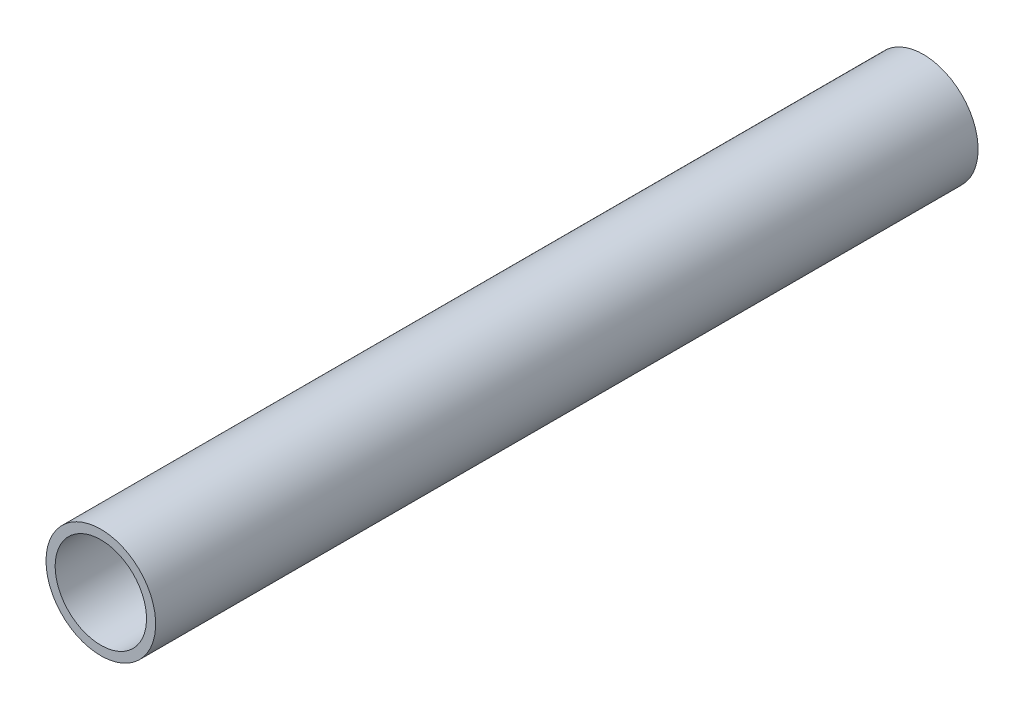
ISO-10303-21;
HEADER;
FILE_DESCRIPTION(('STEP AP214'),'2;1');
FILE_NAME('part.step','',(''),(''),'','','');
FILE_SCHEMA(('AUTOMOTIVE_DESIGN { 1 0 10303 214 1 1 1 1 }'));
ENDSEC;
DATA;
#1=APPLICATION_CONTEXT('core data for automotive mechanical design processes');
#2=APPLICATION_PROTOCOL_DEFINITION('international standard','automotive_design',2000,#1);
#3=PRODUCT_CONTEXT('',#1,'mechanical');
#4=PRODUCT('Part','Part','',(#3));
#5=PRODUCT_RELATED_PRODUCT_CATEGORY('part','',(#4));
#6=PRODUCT_DEFINITION_FORMATION('','',#4);
#7=PRODUCT_DEFINITION_CONTEXT('part definition',#1,'design');
#8=PRODUCT_DEFINITION('design','',#6,#7);
#9=PRODUCT_DEFINITION_SHAPE('','',#8);
#10=(LENGTH_UNIT() NAMED_UNIT(*) SI_UNIT(.MILLI.,.METRE.));
#11=(NAMED_UNIT(*) PLANE_ANGLE_UNIT() SI_UNIT($,.RADIAN.));
#12=(NAMED_UNIT(*) SI_UNIT($,.STERADIAN.) SOLID_ANGLE_UNIT());
#13=UNCERTAINTY_MEASURE_WITH_UNIT(LENGTH_MEASURE(1.E-05),#10,'distance_accuracy_value','');
#14=(GEOMETRIC_REPRESENTATION_CONTEXT(3) GLOBAL_UNCERTAINTY_ASSIGNED_CONTEXT((#13)) GLOBAL_UNIT_ASSIGNED_CONTEXT((#10,
#11,#12)) REPRESENTATION_CONTEXT('',''));
#15=CARTESIAN_POINT('',(0.,0.,0.));
#16=DIRECTION('',(0.,0.,1.));
#17=DIRECTION('',(1.,0.,0.));
#18=AXIS2_PLACEMENT_3D('',#15,#16,#17);
#19=CARTESIAN_POINT('',(0.,0.,90.));
#20=DIRECTION('',(0.,0.,1.));
#21=DIRECTION('',(1.,0.,0.));
#22=AXIS2_PLACEMENT_3D('',#19,#20,#21);
#23=PLANE('',#22);
#24=CARTESIAN_POINT('',(0.,0.,90.));
#25=DIRECTION('',(0.,0.,1.));
#26=DIRECTION('',(1.,0.,0.));
#27=AXIS2_PLACEMENT_3D('',#24,#25,#26);
#28=CIRCLE('',#27,6.);
#29=CARTESIAN_POINT('',(-6.,0.,90.));
#30=VERTEX_POINT('',#29);
#31=EDGE_CURVE('E10',#30,#30,#28,.T.);
#32=ORIENTED_EDGE('',*,*,#31,.T.);
#33=EDGE_LOOP('',(#32));
#34=FACE_BOUND('',#33,.T.);
#35=CARTESIAN_POINT('',(0.,0.,90.));
#36=DIRECTION('',(0.,0.,1.));
#37=DIRECTION('',(1.,0.,0.));
#38=AXIS2_PLACEMENT_3D('',#35,#36,#37);
#39=CIRCLE('',#38,5.);
#40=CARTESIAN_POINT('',(-5.,0.,90.));
#41=VERTEX_POINT('',#40);
#42=EDGE_CURVE('E42',#41,#41,#39,.T.);
#43=ORIENTED_EDGE('',*,*,#42,.F.);
#44=EDGE_LOOP('',(#43));
#45=FACE_BOUND('',#44,.T.);
#46=ADVANCED_FACE('F31',(#34,#45),#23,.T.);
#47=CARTESIAN_POINT('',(0.,0.,0.));
#48=DIRECTION('',(0.,0.,1.));
#49=DIRECTION('',(1.,0.,0.));
#50=AXIS2_PLACEMENT_3D('',#47,#48,#49);
#51=PLANE('',#50);
#52=CARTESIAN_POINT('',(0.,0.,0.));
#53=DIRECTION('',(0.,0.,1.));
#54=DIRECTION('',(1.,0.,0.));
#55=AXIS2_PLACEMENT_3D('',#52,#53,#54);
#56=CIRCLE('',#55,6.);
#57=CARTESIAN_POINT('',(-6.,0.,0.));
#58=VERTEX_POINT('',#57);
#59=EDGE_CURVE('E35',#58,#58,#56,.T.);
#60=ORIENTED_EDGE('',*,*,#59,.F.);
#61=EDGE_LOOP('',(#60));
#62=FACE_BOUND('',#61,.T.);
#63=CARTESIAN_POINT('',(0.,0.,0.));
#64=DIRECTION('',(0.,0.,1.));
#65=DIRECTION('',(1.,0.,0.));
#66=AXIS2_PLACEMENT_3D('',#63,#64,#65);
#67=CIRCLE('',#66,5.);
#68=CARTESIAN_POINT('',(-5.,0.,0.));
#69=VERTEX_POINT('',#68);
#70=EDGE_CURVE('E44',#69,#69,#67,.T.);
#71=ORIENTED_EDGE('',*,*,#70,.T.);
#72=EDGE_LOOP('',(#71));
#73=FACE_BOUND('',#72,.T.);
#74=ADVANCED_FACE('F54',(#62,#73),#51,.F.);
#75=CARTESIAN_POINT('',(0.,0.,90.));
#76=DIRECTION('',(0.,0.,-1.));
#77=DIRECTION('',(-1.,0.,0.));
#78=AXIS2_PLACEMENT_3D('',#75,#76,#77);
#79=CYLINDRICAL_SURFACE('',#78,6.);
#80=CARTESIAN_POINT('',(-6.,0.,90.));
#81=CARTESIAN_POINT('',(-6.,0.,89.0625));
#82=CARTESIAN_POINT('',(-6.,0.,88.125));
#83=CARTESIAN_POINT('',(-6.,0.,86.25));
#84=CARTESIAN_POINT('',(-6.,0.,85.3125));
#85=CARTESIAN_POINT('',(-6.,0.,83.4375));
#86=CARTESIAN_POINT('',(-6.,0.,82.5));
#87=CARTESIAN_POINT('',(-6.,0.,80.625));
#88=CARTESIAN_POINT('',(-6.,0.,79.6875));
#89=CARTESIAN_POINT('',(-6.,0.,77.8125));
#90=CARTESIAN_POINT('',(-6.,0.,76.875));
#91=CARTESIAN_POINT('',(-6.,0.,75.));
#92=CARTESIAN_POINT('',(-6.,0.,74.0625));
#93=CARTESIAN_POINT('',(-6.,0.,72.1875));
#94=CARTESIAN_POINT('',(-6.,0.,71.25));
#95=CARTESIAN_POINT('',(-6.,0.,69.375));
#96=CARTESIAN_POINT('',(-6.,0.,68.4375));
#97=CARTESIAN_POINT('',(-6.,0.,66.5625));
#98=CARTESIAN_POINT('',(-6.,0.,65.625));
#99=CARTESIAN_POINT('',(-6.,0.,63.75));
#100=CARTESIAN_POINT('',(-6.,0.,62.8125));
#101=CARTESIAN_POINT('',(-6.,0.,60.9375));
#102=CARTESIAN_POINT('',(-6.,0.,60.));
#103=CARTESIAN_POINT('',(-6.,0.,58.125));
#104=CARTESIAN_POINT('',(-6.,0.,57.1875));
#105=CARTESIAN_POINT('',(-6.,0.,55.3125));
#106=CARTESIAN_POINT('',(-6.,0.,54.375));
#107=CARTESIAN_POINT('',(-6.,0.,52.5));
#108=CARTESIAN_POINT('',(-6.,0.,51.5625));
#109=CARTESIAN_POINT('',(-6.,0.,49.6875));
#110=CARTESIAN_POINT('',(-6.,0.,48.75));
#111=CARTESIAN_POINT('',(-6.,0.,46.875));
#112=CARTESIAN_POINT('',(-6.,0.,45.9375));
#113=CARTESIAN_POINT('',(-6.,0.,44.0625));
#114=CARTESIAN_POINT('',(-6.,0.,43.125));
#115=CARTESIAN_POINT('',(-6.,0.,41.25));
#116=CARTESIAN_POINT('',(-6.,0.,40.3125));
#117=CARTESIAN_POINT('',(-6.,0.,38.4375));
#118=CARTESIAN_POINT('',(-6.,0.,37.5));
#119=CARTESIAN_POINT('',(-6.,0.,35.625));
#120=CARTESIAN_POINT('',(-6.,0.,34.6875));
#121=CARTESIAN_POINT('',(-6.,0.,32.8125));
#122=CARTESIAN_POINT('',(-6.,0.,31.875));
#123=CARTESIAN_POINT('',(-6.,0.,30.));
#124=CARTESIAN_POINT('',(-6.,0.,29.0625));
#125=CARTESIAN_POINT('',(-6.,0.,27.1875));
#126=CARTESIAN_POINT('',(-6.,0.,26.25));
#127=CARTESIAN_POINT('',(-6.,0.,24.375));
#128=CARTESIAN_POINT('',(-6.,0.,23.4375));
#129=CARTESIAN_POINT('',(-6.,0.,21.5625));
#130=CARTESIAN_POINT('',(-6.,0.,20.625));
#131=CARTESIAN_POINT('',(-6.,0.,18.75));
#132=CARTESIAN_POINT('',(-6.,0.,17.8125));
#133=CARTESIAN_POINT('',(-6.,0.,15.9375));
#134=CARTESIAN_POINT('',(-6.,0.,15.));
#135=CARTESIAN_POINT('',(-6.,0.,13.125));
#136=CARTESIAN_POINT('',(-6.,0.,12.1875));
#137=CARTESIAN_POINT('',(-6.,0.,10.3125));
#138=CARTESIAN_POINT('',(-6.,0.,9.37499999999999));
#139=CARTESIAN_POINT('',(-6.,0.,7.49999999999999));
#140=CARTESIAN_POINT('',(-6.,0.,6.56249999999999));
#141=CARTESIAN_POINT('',(-6.,0.,4.68749999999999));
#142=CARTESIAN_POINT('',(-6.,0.,3.74999999999998));
#143=CARTESIAN_POINT('',(-6.,0.,1.87499999999998));
#144=CARTESIAN_POINT('',(-6.,0.,0.937499999999986));
#145=CARTESIAN_POINT('',(-6.,0.,0.));
#146=B_SPLINE_CURVE_WITH_KNOTS('',3,(#80,#81,#82,#83,#84,#85,#86,#87,#88,#89,#90,#91,#92,#93,
#94,#95,#96,#97,#98,#99,#100,#101,#102,#103,#104,#105,#106,#107,#108,#109,#110,#111,#112,#113,
#114,#115,#116,#117,#118,#119,#120,#121,#122,#123,#124,#125,#126,#127,#128,#129,#130,#131,#132,
#133,#134,#135,#136,#137,#138,#139,#140,#141,#142,#143,#144,#145),.UNSPECIFIED.,.F.,.F.,(4,2,2,
2,2,2,2,2,2,2,2,2,2,2,2,2,2,2,2,2,2,2,2,2,2,2,2,2,2,2,2,2,4),(0.,2.81250000000001,
5.62500000000001,8.43750000000001,11.25,14.0625,16.875,19.6875,22.5,25.3125,28.125,30.9375,
33.75,36.5625,39.375,42.1875,45.,47.8125,50.625,53.4375,56.25,59.0625,61.875,64.6875,67.5,
70.3125,73.125,75.9375,78.75,81.5625,84.375,87.1875,90.),.UNSPECIFIED.);
#147=EDGE_CURVE('BSEAM33',#30,#58,#146,.T.);
#148=ORIENTED_EDGE('',*,*,#31,.F.);
#149=ORIENTED_EDGE('',*,*,#59,.T.);
#150=ORIENTED_EDGE('',*,*,#147,.T.);
#151=ORIENTED_EDGE('',*,*,#147,.F.);
#152=EDGE_LOOP('',(#148,#150,#149,#151));
#153=FACE_BOUND('',#152,.T.);
#154=ADVANCED_FACE('F33',(#153),#79,.T.);
#155=CARTESIAN_POINT('',(0.,0.,90.));
#156=DIRECTION('',(0.,0.,-1.));
#157=DIRECTION('',(-1.,0.,0.));
#158=AXIS2_PLACEMENT_3D('',#155,#156,#157);
#159=CYLINDRICAL_SURFACE('',#158,5.);
#160=CARTESIAN_POINT('',(-5.,0.,90.));
#161=CARTESIAN_POINT('',(-5.,0.,89.0625));
#162=CARTESIAN_POINT('',(-5.,0.,88.125));
#163=CARTESIAN_POINT('',(-5.,0.,86.25));
#164=CARTESIAN_POINT('',(-5.,0.,85.3125));
#165=CARTESIAN_POINT('',(-5.,0.,83.4375));
#166=CARTESIAN_POINT('',(-5.,0.,82.5));
#167=CARTESIAN_POINT('',(-5.,0.,80.625));
#168=CARTESIAN_POINT('',(-5.,0.,79.6875));
#169=CARTESIAN_POINT('',(-5.,0.,77.8125));
#170=CARTESIAN_POINT('',(-5.,0.,76.875));
#171=CARTESIAN_POINT('',(-5.,0.,75.));
#172=CARTESIAN_POINT('',(-5.,0.,74.0625));
#173=CARTESIAN_POINT('',(-5.,0.,72.1875));
#174=CARTESIAN_POINT('',(-5.,0.,71.25));
#175=CARTESIAN_POINT('',(-5.,0.,69.375));
#176=CARTESIAN_POINT('',(-5.,0.,68.4375));
#177=CARTESIAN_POINT('',(-5.,0.,66.5625));
#178=CARTESIAN_POINT('',(-5.,0.,65.625));
#179=CARTESIAN_POINT('',(-5.,0.,63.75));
#180=CARTESIAN_POINT('',(-5.,0.,62.8125));
#181=CARTESIAN_POINT('',(-5.,0.,60.9375));
#182=CARTESIAN_POINT('',(-5.,0.,60.));
#183=CARTESIAN_POINT('',(-5.,0.,58.125));
#184=CARTESIAN_POINT('',(-5.,0.,57.1875));
#185=CARTESIAN_POINT('',(-5.,0.,55.3125));
#186=CARTESIAN_POINT('',(-5.,0.,54.375));
#187=CARTESIAN_POINT('',(-5.,0.,52.5));
#188=CARTESIAN_POINT('',(-5.,0.,51.5625));
#189=CARTESIAN_POINT('',(-5.,0.,49.6875));
#190=CARTESIAN_POINT('',(-5.,0.,48.75));
#191=CARTESIAN_POINT('',(-5.,0.,46.875));
#192=CARTESIAN_POINT('',(-5.,0.,45.9375));
#193=CARTESIAN_POINT('',(-5.,0.,44.0625));
#194=CARTESIAN_POINT('',(-5.,0.,43.125));
#195=CARTESIAN_POINT('',(-5.,0.,41.25));
#196=CARTESIAN_POINT('',(-5.,0.,40.3125));
#197=CARTESIAN_POINT('',(-5.,0.,38.4375));
#198=CARTESIAN_POINT('',(-5.,0.,37.5));
#199=CARTESIAN_POINT('',(-5.,0.,35.625));
#200=CARTESIAN_POINT('',(-5.,0.,34.6875));
#201=CARTESIAN_POINT('',(-5.,0.,32.8125));
#202=CARTESIAN_POINT('',(-5.,0.,31.875));
#203=CARTESIAN_POINT('',(-5.,0.,30.));
#204=CARTESIAN_POINT('',(-5.,0.,29.0625));
#205=CARTESIAN_POINT('',(-5.,0.,27.1875));
#206=CARTESIAN_POINT('',(-5.,0.,26.25));
#207=CARTESIAN_POINT('',(-5.,0.,24.375));
#208=CARTESIAN_POINT('',(-5.,0.,23.4375));
#209=CARTESIAN_POINT('',(-5.,0.,21.5625));
#210=CARTESIAN_POINT('',(-5.,0.,20.625));
#211=CARTESIAN_POINT('',(-5.,0.,18.75));
#212=CARTESIAN_POINT('',(-5.,0.,17.8125));
#213=CARTESIAN_POINT('',(-5.,0.,15.9375));
#214=CARTESIAN_POINT('',(-5.,0.,15.));
#215=CARTESIAN_POINT('',(-5.,0.,13.125));
#216=CARTESIAN_POINT('',(-5.,0.,12.1875));
#217=CARTESIAN_POINT('',(-5.,0.,10.3125));
#218=CARTESIAN_POINT('',(-5.,0.,9.37499999999999));
#219=CARTESIAN_POINT('',(-5.,0.,7.49999999999999));
#220=CARTESIAN_POINT('',(-5.,0.,6.56249999999999));
#221=CARTESIAN_POINT('',(-5.,0.,4.68749999999999));
#222=CARTESIAN_POINT('',(-5.,0.,3.74999999999998));
#223=CARTESIAN_POINT('',(-5.,0.,1.87499999999998));
#224=CARTESIAN_POINT('',(-5.,0.,0.937499999999986));
#225=CARTESIAN_POINT('',(-5.,0.,0.));
#226=B_SPLINE_CURVE_WITH_KNOTS('',3,(#160,#161,#162,#163,#164,#165,#166,#167,#168,#169,#170,
#171,#172,#173,#174,#175,#176,#177,#178,#179,#180,#181,#182,#183,#184,#185,#186,#187,#188,#189,
#190,#191,#192,#193,#194,#195,#196,#197,#198,#199,#200,#201,#202,#203,#204,#205,#206,#207,#208,
#209,#210,#211,#212,#213,#214,#215,#216,#217,#218,#219,#220,#221,#222,#223,#224,#225),
.UNSPECIFIED.,.F.,.F.,(4,2,2,2,2,2,2,2,2,2,2,2,2,2,2,2,2,2,2,2,2,2,2,2,2,2,2,2,2,2,2,2,4),(0.,
2.8125,5.62499999999999,8.43749999999999,11.25,14.0625,16.875,19.6875,22.5,25.3125,28.125,
30.9375,33.75,36.5625,39.375,42.1875,45.,47.8125,50.625,53.4375,56.25,59.0625,61.875,64.6875,
67.5,70.3125,73.125,75.9375,78.75,81.5625,84.375,87.1875,90.),.UNSPECIFIED.);
#227=EDGE_CURVE('BSEAM50',#41,#69,#226,.T.);
#228=ORIENTED_EDGE('',*,*,#42,.T.);
#229=ORIENTED_EDGE('',*,*,#70,.F.);
#230=ORIENTED_EDGE('',*,*,#227,.T.);
#231=ORIENTED_EDGE('',*,*,#227,.F.);
#232=EDGE_LOOP('',(#228,#230,#229,#231));
#233=FACE_BOUND('',#232,.T.);
#234=ADVANCED_FACE('F50',(#233),#159,.F.);
#235=CLOSED_SHELL('',(#46,#74,#154,#234));
#236=MANIFOLD_SOLID_BREP('B2',#235);
#237=ADVANCED_BREP_SHAPE_REPRESENTATION('',(#18,#236),#14);
#238=SHAPE_DEFINITION_REPRESENTATION(#9,#237);
ENDSEC;
END-ISO-10303-21;
